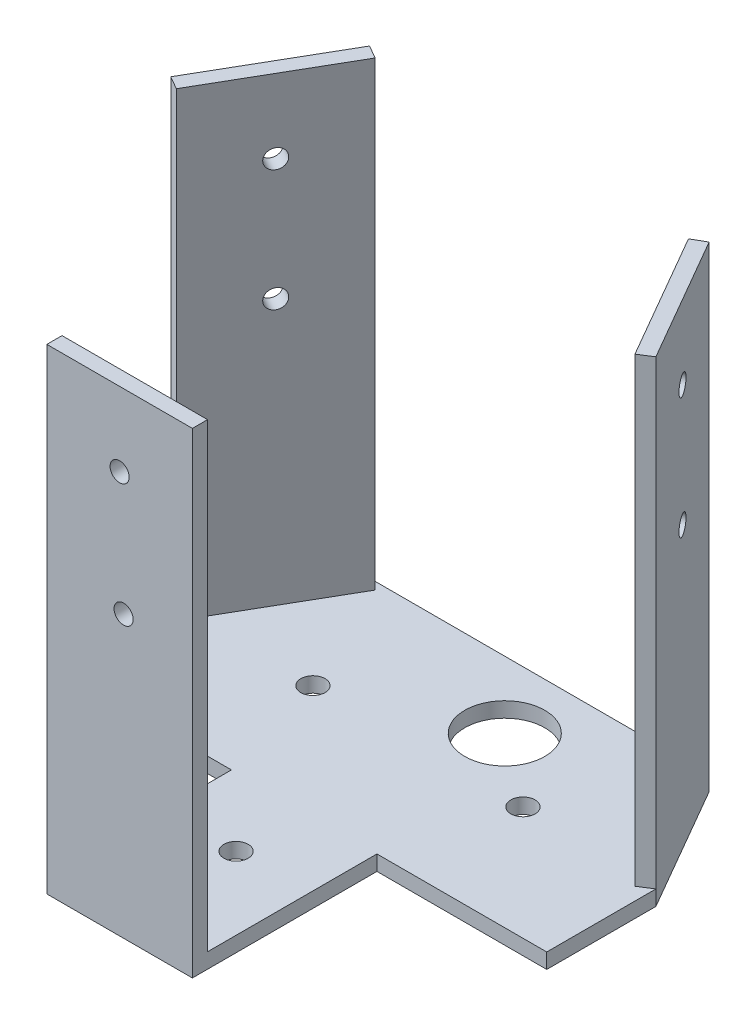
ISO-10303-21;
HEADER;
FILE_DESCRIPTION(('STEP AP214'),'2;1');
FILE_NAME('part.step','',(''),(''),'','','');
FILE_SCHEMA(('AUTOMOTIVE_DESIGN { 1 0 10303 214 1 1 1 1 }'));
ENDSEC;
DATA;
#1=APPLICATION_CONTEXT('core data for automotive mechanical design processes');
#2=APPLICATION_PROTOCOL_DEFINITION('international standard','automotive_design',2000,#1);
#3=PRODUCT_CONTEXT('',#1,'mechanical');
#4=PRODUCT('Part','Part','',(#3));
#5=PRODUCT_RELATED_PRODUCT_CATEGORY('part','',(#4));
#6=PRODUCT_DEFINITION_FORMATION('','',#4);
#7=PRODUCT_DEFINITION_CONTEXT('part definition',#1,'design');
#8=PRODUCT_DEFINITION('design','',#6,#7);
#9=PRODUCT_DEFINITION_SHAPE('','',#8);
#10=(LENGTH_UNIT() NAMED_UNIT(*) SI_UNIT(.MILLI.,.METRE.));
#11=(NAMED_UNIT(*) PLANE_ANGLE_UNIT() SI_UNIT($,.RADIAN.));
#12=(NAMED_UNIT(*) SI_UNIT($,.STERADIAN.) SOLID_ANGLE_UNIT());
#13=UNCERTAINTY_MEASURE_WITH_UNIT(LENGTH_MEASURE(1.E-05),#10,'distance_accuracy_value','');
#14=(GEOMETRIC_REPRESENTATION_CONTEXT(3) GLOBAL_UNCERTAINTY_ASSIGNED_CONTEXT((#13)) GLOBAL_UNIT_ASSIGNED_CONTEXT((#10,
#11,#12)) REPRESENTATION_CONTEXT('',''));
#15=CARTESIAN_POINT('',(0.,0.,0.));
#16=DIRECTION('',(0.,0.,1.));
#17=DIRECTION('',(1.,0.,0.));
#18=AXIS2_PLACEMENT_3D('',#15,#16,#17);
#19=CARTESIAN_POINT('',(0.,1.5875,0.));
#20=DIRECTION('',(0.,1.,0.));
#21=DIRECTION('',(0.,0.,1.));
#22=AXIS2_PLACEMENT_3D('',#19,#20,#21);
#23=PLANE('',#22);
#24=CARTESIAN_POINT('',(28.7785226280624,1.5875,-17.6279871536748));
#25=DIRECTION('',(0.,1.,0.));
#26=DIRECTION('',(0.,0.,1.));
#27=AXIS2_PLACEMENT_3D('',#24,#25,#26);
#28=CIRCLE('',#27,4.19100000000001);
#29=CARTESIAN_POINT('',(28.7785226280624,1.5875,-13.4369871536748));
#30=VERTEX_POINT('',#29);
#31=EDGE_CURVE('E322',#30,#30,#28,.T.);
#32=ORIENTED_EDGE('',*,*,#31,.F.);
#33=EDGE_LOOP('',(#32));
#34=FACE_BOUND('',#33,.T.);
#35=CARTESIAN_POINT('',(14.4014773719377,1.5875,-11.9141212650334));
#36=DIRECTION('',(0.,1.,0.));
#37=DIRECTION('',(0.,0.,1.));
#38=AXIS2_PLACEMENT_3D('',#35,#36,#37);
#39=CIRCLE('',#38,1.27000000000001);
#40=CARTESIAN_POINT('',(14.4014773719377,1.5875,-10.6441212650334));
#41=VERTEX_POINT('',#40);
#42=EDGE_CURVE('E242',#41,#41,#39,.T.);
#43=ORIENTED_EDGE('',*,*,#42,.F.);
#44=EDGE_LOOP('',(#43));
#45=FACE_BOUND('',#44,.T.);
#46=CARTESIAN_POINT('',(36.3985226280624,1.5875,-11.9141212650334));
#47=DIRECTION('',(0.,1.,0.));
#48=DIRECTION('',(0.,0.,1.));
#49=AXIS2_PLACEMENT_3D('',#46,#47,#48);
#50=CIRCLE('',#49,1.27);
#51=CARTESIAN_POINT('',(36.3985226280624,1.5875,-10.6441212650334));
#52=VERTEX_POINT('',#51);
#53=EDGE_CURVE('E261',#52,#52,#50,.T.);
#54=ORIENTED_EDGE('',*,*,#53,.F.);
#55=EDGE_LOOP('',(#54));
#56=FACE_BOUND('',#55,.T.);
#57=CARTESIAN_POINT('',(25.4,1.5875,7.13587873496665));
#58=DIRECTION('',(0.,1.,0.));
#59=DIRECTION('',(0.,0.,1.));
#60=AXIS2_PLACEMENT_3D('',#57,#58,#59);
#61=CIRCLE('',#60,1.27);
#62=CARTESIAN_POINT('',(25.4,1.5875,8.40587873496665));
#63=VERTEX_POINT('',#62);
#64=EDGE_CURVE('E264',#63,#63,#61,.T.);
#65=ORIENTED_EDGE('',*,*,#64,.F.);
#66=EDGE_LOOP('',(#65));
#67=FACE_BOUND('',#66,.T.);
#68=DIRECTION('',(0.,0.,-1.));
#69=VECTOR('',#68,1.);
#70=CARTESIAN_POINT('',(50.8,1.5875,0.));
#71=LINE('',#70,#69);
#72=CARTESIAN_POINT('',(50.8,1.5875,0.));
#73=VERTEX_POINT('',#72);
#74=CARTESIAN_POINT('',(50.8,1.5875,-11.43));
#75=VERTEX_POINT('',#74);
#76=EDGE_CURVE('E245',#73,#75,#71,.T.);
#77=ORIENTED_EDGE('',*,*,#76,.T.);
#78=DIRECTION('',(0.84407034624318,0.,-0.536232459473425));
#79=VECTOR('',#78,1.);
#80=CARTESIAN_POINT('',(49.4600383253389,1.5875,-10.5787309705859));
#81=LINE('',#80,#79);
#82=CARTESIAN_POINT('',(49.4600383253389,1.5875,-10.5787309705859));
#83=VERTEX_POINT('',#82);
#84=EDGE_CURVE('E63',#83,#75,#81,.T.);
#85=ORIENTED_EDGE('',*,*,#84,.F.);
#86=DIRECTION('',(0.5,0.,0.866025403784439));
#87=VECTOR('',#86,1.);
#88=CARTESIAN_POINT('',(41.8064184415405,1.5875,-23.8351894711443));
#89=LINE('',#88,#87);
#90=CARTESIAN_POINT('',(41.8064184415405,1.5875,-23.8351894711443));
#91=VERTEX_POINT('',#90);
#92=EDGE_CURVE('E58',#91,#83,#89,.T.);
#93=ORIENTED_EDGE('',*,*,#92,.F.);
#94=DIRECTION('',(-0.866025403784439,0.,0.499999999999999));
#95=VECTOR('',#94,1.);
#96=CARTESIAN_POINT('',(43.18,1.5875,-24.6282271536748));
#97=LINE('',#96,#95);
#98=CARTESIAN_POINT('',(43.18,1.5875,-24.6282271536748));
#99=VERTEX_POINT('',#98);
#100=EDGE_CURVE('E365',#99,#91,#97,.T.);
#101=ORIENTED_EDGE('',*,*,#100,.F.);
#102=DIRECTION('',(1.,0.,0.));
#103=VECTOR('',#102,1.);
#104=CARTESIAN_POINT('',(0.,1.5875,-24.6282271536748));
#105=LINE('',#104,#103);
#106=CARTESIAN_POINT('',(7.62000000000002,1.5875,-24.6282271536748));
#107=VERTEX_POINT('',#106);
#108=EDGE_CURVE('E248',#107,#99,#105,.T.);
#109=ORIENTED_EDGE('',*,*,#108,.F.);
#110=DIRECTION('',(-0.866025403784438,0.,-0.5));
#111=VECTOR('',#110,1.);
#112=CARTESIAN_POINT('',(7.62000000000002,1.5875,-24.6282271536748));
#113=LINE('',#112,#111);
#114=CARTESIAN_POINT('',(8.99481532850781,1.5875,-23.8344771536748));
#115=VERTEX_POINT('',#114);
#116=EDGE_CURVE('E203',#115,#107,#113,.T.);
#117=ORIENTED_EDGE('',*,*,#116,.F.);
#118=DIRECTION('',(0.500000000000001,0.,-0.866025403784438));
#119=VECTOR('',#118,1.);
#120=CARTESIAN_POINT('',(8.99481532850781,1.5875,-23.8344771536748));
#121=LINE('',#120,#119);
#122=CARTESIAN_POINT('',(1.3748153285078,1.5875,-10.63625));
#123=VERTEX_POINT('',#122);
#124=EDGE_CURVE('E193',#123,#115,#121,.T.);
#125=ORIENTED_EDGE('',*,*,#124,.F.);
#126=DIRECTION('',(0.866025403784438,0.,0.500000000000001));
#127=VECTOR('',#126,1.);
#128=CARTESIAN_POINT('',(1.3748153285078,1.5875,-10.63625));
#129=LINE('',#128,#127);
#130=CARTESIAN_POINT('',(0.,1.5875,-11.43));
#131=VERTEX_POINT('',#130);
#132=EDGE_CURVE('E190',#131,#123,#129,.T.);
#133=ORIENTED_EDGE('',*,*,#132,.F.);
#134=DIRECTION('',(0.,0.,-1.));
#135=VECTOR('',#134,1.);
#136=CARTESIAN_POINT('',(0.,1.5875,0.));
#137=LINE('',#136,#135);
#138=CARTESIAN_POINT('',(0.,1.5875,0.));
#139=VERTEX_POINT('',#138);
#140=EDGE_CURVE('E250',#139,#131,#137,.T.);
#141=ORIENTED_EDGE('',*,*,#140,.F.);
#142=DIRECTION('',(1.,0.,0.));
#143=VECTOR('',#142,1.);
#144=CARTESIAN_POINT('',(0.,1.5875,0.));
#145=LINE('',#144,#143);
#146=CARTESIAN_POINT('',(17.78,1.5875,0.));
#147=VERTEX_POINT('',#146);
#148=EDGE_CURVE('E253',#139,#147,#145,.T.);
#149=ORIENTED_EDGE('',*,*,#148,.T.);
#150=DIRECTION('',(0.,0.,1.));
#151=VECTOR('',#150,1.);
#152=CARTESIAN_POINT('',(17.78,1.5875,0.));
#153=LINE('',#152,#151);
#154=CARTESIAN_POINT('',(17.78,1.5875,17.7403787349666));
#155=VERTEX_POINT('',#154);
#156=EDGE_CURVE('E255',#147,#155,#153,.T.);
#157=ORIENTED_EDGE('',*,*,#156,.T.);
#158=DIRECTION('',(-1.,0.,0.));
#159=VECTOR('',#158,1.);
#160=CARTESIAN_POINT('',(33.02,1.5875,17.7403787349666));
#161=LINE('',#160,#159);
#162=CARTESIAN_POINT('',(33.02,1.5875,17.7403787349666));
#163=VERTEX_POINT('',#162);
#164=EDGE_CURVE('E221',#163,#155,#161,.T.);
#165=ORIENTED_EDGE('',*,*,#164,.F.);
#166=DIRECTION('',(0.,0.,1.));
#167=VECTOR('',#166,1.);
#168=CARTESIAN_POINT('',(33.02,1.5875,0.));
#169=LINE('',#168,#167);
#170=CARTESIAN_POINT('',(33.02,1.5875,0.));
#171=VERTEX_POINT('',#170);
#172=EDGE_CURVE('E258',#171,#163,#169,.T.);
#173=ORIENTED_EDGE('',*,*,#172,.F.);
#174=EDGE_CURVE('E256',#171,#73,#145,.T.);
#175=ORIENTED_EDGE('',*,*,#174,.T.);
#176=EDGE_LOOP('',(#77,#85,#93,#101,#109,#117,#125,#133,#141,#149,#157,#165,#173,#175));
#177=FACE_BOUND('',#176,.T.);
#178=ADVANCED_FACE('F41',(#34,#45,#56,#67,#177),#23,.T.);
#179=CARTESIAN_POINT('',(50.8,1.5875,0.));
#180=DIRECTION('',(-1.,0.,0.));
#181=DIRECTION('',(0.,0.,1.));
#182=AXIS2_PLACEMENT_3D('',#179,#180,#181);
#183=PLANE('',#182);
#184=DIRECTION('',(0.,0.,-1.));
#185=VECTOR('',#184,1.);
#186=CARTESIAN_POINT('',(50.8,0.,0.));
#187=LINE('',#186,#185);
#188=CARTESIAN_POINT('',(50.8,0.,0.));
#189=VERTEX_POINT('',#188);
#190=CARTESIAN_POINT('',(50.8,0.,-11.43));
#191=VERTEX_POINT('',#190);
#192=EDGE_CURVE('E270',#189,#191,#187,.T.);
#193=ORIENTED_EDGE('',*,*,#192,.T.);
#194=DIRECTION('',(0.,-1.,0.));
#195=VECTOR('',#194,1.);
#196=CARTESIAN_POINT('',(50.8,1.5875,-11.43));
#197=LINE('',#196,#195);
#198=EDGE_CURVE('E11',#75,#191,#197,.T.);
#199=ORIENTED_EDGE('',*,*,#198,.F.);
#200=ORIENTED_EDGE('',*,*,#76,.F.);
#201=DIRECTION('',(0.,-1.,0.));
#202=VECTOR('',#201,1.);
#203=CARTESIAN_POINT('',(50.8,1.5875,0.));
#204=LINE('',#203,#202);
#205=EDGE_CURVE('E267',#73,#189,#204,.T.);
#206=ORIENTED_EDGE('',*,*,#205,.T.);
#207=EDGE_LOOP('',(#193,#199,#200,#206));
#208=FACE_BOUND('',#207,.T.);
#209=ADVANCED_FACE('F418',(#208),#183,.F.);
#210=CARTESIAN_POINT('',(43.049335182628,1.5875,-24.8545452561248));
#211=DIRECTION('',(-0.866025403784438,0.,0.500000000000002));
#212=DIRECTION('',(0.500000000000002,0.,0.866025403784438));
#213=AXIS2_PLACEMENT_3D('',#210,#211,#212);
#214=PLANE('',#213);
#215=CARTESIAN_POINT('',(46.99,29.4025,-18.0291135768374));
#216=DIRECTION('',(0.866025403784438,0.,-0.500000000000002));
#217=DIRECTION('',(-0.500000000000002,0.,-0.866025403784438));
#218=AXIS2_PLACEMENT_3D('',#215,#216,#217);
#219=CIRCLE('',#218,0.999999999999999);
#220=CARTESIAN_POINT('',(46.49,29.4025,-18.8951389806219));
#221=VERTEX_POINT('',#220);
#222=EDGE_CURVE('E330',#221,#221,#219,.T.);
#223=ORIENTED_EDGE('',*,*,#222,.F.);
#224=EDGE_LOOP('',(#223));
#225=FACE_BOUND('',#224,.T.);
#226=CARTESIAN_POINT('',(46.99,42.1025,-18.0291135768374));
#227=DIRECTION('',(0.866025403784438,0.,-0.500000000000002));
#228=DIRECTION('',(-0.500000000000002,0.,-0.866025403784438));
#229=AXIS2_PLACEMENT_3D('',#226,#227,#228);
#230=CIRCLE('',#229,0.999999999999999);
#231=CARTESIAN_POINT('',(46.49,42.1025,-18.8951389806219));
#232=VERTEX_POINT('',#231);
#233=EDGE_CURVE('E326',#232,#232,#230,.T.);
#234=ORIENTED_EDGE('',*,*,#233,.F.);
#235=EDGE_LOOP('',(#234));
#236=FACE_BOUND('',#235,.T.);
#237=DIRECTION('',(-0.500000000000002,0.,-0.866025403784438));
#238=VECTOR('',#237,1.);
#239=CARTESIAN_POINT('',(43.049335182628,0.,-24.8545452561248));
#240=LINE('',#239,#238);
#241=CARTESIAN_POINT('',(43.18,0.,-24.6282271536748));
#242=VERTEX_POINT('',#241);
#243=EDGE_CURVE('E273',#191,#242,#240,.T.);
#244=ORIENTED_EDGE('',*,*,#243,.T.);
#245=DIRECTION('',(0.,-1.,0.));
#246=VECTOR('',#245,1.);
#247=CARTESIAN_POINT('',(43.18,1.5875,-24.6282271536748));
#248=LINE('',#247,#246);
#249=EDGE_CURVE('E50',#99,#242,#248,.T.);
#250=ORIENTED_EDGE('',*,*,#249,.F.);
#251=DIRECTION('',(0.,-1.,0.));
#252=VECTOR('',#251,1.);
#253=CARTESIAN_POINT('',(43.18,49.8475,-24.6282271536748));
#254=LINE('',#253,#252);
#255=CARTESIAN_POINT('',(43.18,49.8475,-24.6282271536748));
#256=VERTEX_POINT('',#255);
#257=EDGE_CURVE('E175',#256,#99,#254,.T.);
#258=ORIENTED_EDGE('',*,*,#257,.F.);
#259=DIRECTION('',(-0.500000000000001,0.,-0.866025403784438));
#260=VECTOR('',#259,1.);
#261=CARTESIAN_POINT('',(50.8,49.8475,-11.43));
#262=LINE('',#261,#260);
#263=CARTESIAN_POINT('',(50.8,49.8475,-11.43));
#264=VERTEX_POINT('',#263);
#265=EDGE_CURVE('E167',#264,#256,#262,.T.);
#266=ORIENTED_EDGE('',*,*,#265,.F.);
#267=DIRECTION('',(0.,-1.,0.));
#268=VECTOR('',#267,1.);
#269=CARTESIAN_POINT('',(50.8,49.8475,-11.43));
#270=LINE('',#269,#268);
#271=EDGE_CURVE('E172',#264,#75,#270,.T.);
#272=ORIENTED_EDGE('',*,*,#271,.T.);
#273=ORIENTED_EDGE('',*,*,#198,.T.);
#274=EDGE_LOOP('',(#244,#250,#258,#266,#272,#273));
#275=FACE_BOUND('',#274,.T.);
#276=ADVANCED_FACE('F170',(#225,#236,#275),#214,.F.);
#277=CARTESIAN_POINT('',(0.,1.5875,-24.6282271536748));
#278=DIRECTION('',(0.,0.,-1.));
#279=DIRECTION('',(-1.,0.,0.));
#280=AXIS2_PLACEMENT_3D('',#277,#278,#279);
#281=PLANE('',#280);
#282=DIRECTION('',(1.,0.,0.));
#283=VECTOR('',#282,1.);
#284=CARTESIAN_POINT('',(0.,0.,-24.6282271536748));
#285=LINE('',#284,#283);
#286=CARTESIAN_POINT('',(7.62000000000002,0.,-24.6282271536748));
#287=VERTEX_POINT('',#286);
#288=EDGE_CURVE('E275',#287,#242,#285,.T.);
#289=ORIENTED_EDGE('',*,*,#288,.F.);
#290=DIRECTION('',(0.,-1.,0.));
#291=VECTOR('',#290,1.);
#292=CARTESIAN_POINT('',(7.62000000000002,1.5875,-24.6282271536748));
#293=LINE('',#292,#291);
#294=EDGE_CURVE('E316',#107,#287,#293,.T.);
#295=ORIENTED_EDGE('',*,*,#294,.F.);
#296=ORIENTED_EDGE('',*,*,#108,.T.);
#297=ORIENTED_EDGE('',*,*,#249,.T.);
#298=EDGE_LOOP('',(#289,#295,#296,#297));
#299=FACE_BOUND('',#298,.T.);
#300=ADVANCED_FACE('F380',(#299),#281,.T.);
#301=CARTESIAN_POINT('',(-4.94933518262807,1.5875,-2.85750000000001));
#302=DIRECTION('',(-0.866025403784438,0.,-0.500000000000001));
#303=DIRECTION('',(-0.500000000000001,0.,0.866025403784438));
#304=AXIS2_PLACEMENT_3D('',#301,#302,#303);
#305=PLANE('',#304);
#306=CARTESIAN_POINT('',(3.81,29.4025,-18.0291135768374));
#307=DIRECTION('',(-0.866025403784438,0.,-0.500000000000001));
#308=DIRECTION('',(-0.500000000000001,0.,0.866025403784438));
#309=AXIS2_PLACEMENT_3D('',#306,#307,#308);
#310=CIRCLE('',#309,1.);
#311=CARTESIAN_POINT('',(3.31,29.4025,-17.163088173053));
#312=VERTEX_POINT('',#311);
#313=EDGE_CURVE('E337',#312,#312,#310,.T.);
#314=ORIENTED_EDGE('',*,*,#313,.F.);
#315=EDGE_LOOP('',(#314));
#316=FACE_BOUND('',#315,.T.);
#317=CARTESIAN_POINT('',(3.81,42.1025,-18.0291135768374));
#318=DIRECTION('',(-0.866025403784438,0.,-0.500000000000001));
#319=DIRECTION('',(-0.500000000000001,0.,0.866025403784438));
#320=AXIS2_PLACEMENT_3D('',#317,#318,#319);
#321=CIRCLE('',#320,1.);
#322=CARTESIAN_POINT('',(3.31,42.1025,-17.163088173053));
#323=VERTEX_POINT('',#322);
#324=EDGE_CURVE('E334',#323,#323,#321,.T.);
#325=ORIENTED_EDGE('',*,*,#324,.F.);
#326=EDGE_LOOP('',(#325));
#327=FACE_BOUND('',#326,.T.);
#328=DIRECTION('',(0.500000000000001,0.,-0.866025403784438));
#329=VECTOR('',#328,1.);
#330=CARTESIAN_POINT('',(-4.94933518262807,0.,-2.85750000000001));
#331=LINE('',#330,#329);
#332=CARTESIAN_POINT('',(0.,0.,-11.43));
#333=VERTEX_POINT('',#332);
#334=EDGE_CURVE('E278',#333,#287,#331,.T.);
#335=ORIENTED_EDGE('',*,*,#334,.F.);
#336=DIRECTION('',(0.,-1.,0.));
#337=VECTOR('',#336,1.);
#338=CARTESIAN_POINT('',(0.,1.5875,-11.43));
#339=LINE('',#338,#337);
#340=EDGE_CURVE('E314',#131,#333,#339,.T.);
#341=ORIENTED_EDGE('',*,*,#340,.F.);
#342=DIRECTION('',(0.,-1.,0.));
#343=VECTOR('',#342,1.);
#344=CARTESIAN_POINT('',(0.,49.8475,-11.43));
#345=LINE('',#344,#343);
#346=CARTESIAN_POINT('',(0.,49.8475,-11.43));
#347=VERTEX_POINT('',#346);
#348=EDGE_CURVE('E208',#347,#131,#345,.T.);
#349=ORIENTED_EDGE('',*,*,#348,.F.);
#350=DIRECTION('',(-0.500000000000001,0.,0.866025403784438));
#351=VECTOR('',#350,1.);
#352=CARTESIAN_POINT('',(0.,49.8475,-11.43));
#353=LINE('',#352,#351);
#354=CARTESIAN_POINT('',(7.62000000000002,49.8475,-24.6282271536748));
#355=VERTEX_POINT('',#354);
#356=EDGE_CURVE('E207',#355,#347,#353,.T.);
#357=ORIENTED_EDGE('',*,*,#356,.F.);
#358=DIRECTION('',(0.,-1.,0.));
#359=VECTOR('',#358,1.);
#360=CARTESIAN_POINT('',(7.62000000000002,49.8475,-24.6282271536748));
#361=LINE('',#360,#359);
#362=EDGE_CURVE('E214',#355,#107,#361,.T.);
#363=ORIENTED_EDGE('',*,*,#362,.T.);
#364=ORIENTED_EDGE('',*,*,#294,.T.);
#365=EDGE_LOOP('',(#335,#341,#349,#357,#363,#364));
#366=FACE_BOUND('',#365,.T.);
#367=ADVANCED_FACE('F391',(#316,#327,#366),#305,.T.);
#368=CARTESIAN_POINT('',(0.,1.5875,0.));
#369=DIRECTION('',(-1.,0.,0.));
#370=DIRECTION('',(0.,0.,1.));
#371=AXIS2_PLACEMENT_3D('',#368,#369,#370);
#372=PLANE('',#371);
#373=DIRECTION('',(0.,0.,-1.));
#374=VECTOR('',#373,1.);
#375=CARTESIAN_POINT('',(0.,0.,0.));
#376=LINE('',#375,#374);
#377=CARTESIAN_POINT('',(0.,0.,0.));
#378=VERTEX_POINT('',#377);
#379=EDGE_CURVE('E281',#378,#333,#376,.T.);
#380=ORIENTED_EDGE('',*,*,#379,.F.);
#381=DIRECTION('',(0.,-1.,0.));
#382=VECTOR('',#381,1.);
#383=CARTESIAN_POINT('',(0.,1.5875,0.));
#384=LINE('',#383,#382);
#385=EDGE_CURVE('E312',#139,#378,#384,.T.);
#386=ORIENTED_EDGE('',*,*,#385,.F.);
#387=ORIENTED_EDGE('',*,*,#140,.T.);
#388=ORIENTED_EDGE('',*,*,#340,.T.);
#389=EDGE_LOOP('',(#380,#386,#387,#388));
#390=FACE_BOUND('',#389,.T.);
#391=ADVANCED_FACE('F459',(#390),#372,.T.);
#392=CARTESIAN_POINT('',(0.,1.5875,0.));
#393=DIRECTION('',(0.,0.,-1.));
#394=DIRECTION('',(-1.,0.,0.));
#395=AXIS2_PLACEMENT_3D('',#392,#393,#394);
#396=PLANE('',#395);
#397=DIRECTION('',(1.,0.,0.));
#398=VECTOR('',#397,1.);
#399=CARTESIAN_POINT('',(0.,0.,0.));
#400=LINE('',#399,#398);
#401=CARTESIAN_POINT('',(17.78,0.,0.));
#402=VERTEX_POINT('',#401);
#403=EDGE_CURVE('E284',#378,#402,#400,.T.);
#404=ORIENTED_EDGE('',*,*,#403,.T.);
#405=DIRECTION('',(0.,-1.,0.));
#406=VECTOR('',#405,1.);
#407=CARTESIAN_POINT('',(17.78,1.5875,0.));
#408=LINE('',#407,#406);
#409=EDGE_CURVE('E309',#147,#402,#408,.T.);
#410=ORIENTED_EDGE('',*,*,#409,.F.);
#411=ORIENTED_EDGE('',*,*,#148,.F.);
#412=ORIENTED_EDGE('',*,*,#385,.T.);
#413=EDGE_LOOP('',(#404,#410,#411,#412));
#414=FACE_BOUND('',#413,.T.);
#415=ADVANCED_FACE('F447',(#414),#396,.F.);
#416=CARTESIAN_POINT('',(17.78,1.5875,0.));
#417=DIRECTION('',(1.,0.,0.));
#418=DIRECTION('',(0.,0.,-1.));
#419=AXIS2_PLACEMENT_3D('',#416,#417,#418);
#420=PLANE('',#419);
#421=DIRECTION('',(0.,0.,1.));
#422=VECTOR('',#421,1.);
#423=CARTESIAN_POINT('',(17.78,0.,0.));
#424=LINE('',#423,#422);
#425=CARTESIAN_POINT('',(17.78,0.,19.3278787349666));
#426=VERTEX_POINT('',#425);
#427=EDGE_CURVE('E286',#402,#426,#424,.T.);
#428=ORIENTED_EDGE('',*,*,#427,.T.);
#429=DIRECTION('',(0.,-1.,0.));
#430=VECTOR('',#429,1.);
#431=CARTESIAN_POINT('',(17.78,1.5875,19.3278787349666));
#432=LINE('',#431,#430);
#433=CARTESIAN_POINT('',(17.78,49.8475,19.3278787349666));
#434=VERTEX_POINT('',#433);
#435=EDGE_CURVE('E306',#434,#426,#432,.T.);
#436=ORIENTED_EDGE('',*,*,#435,.F.);
#437=DIRECTION('',(0.,0.,1.));
#438=VECTOR('',#437,1.);
#439=CARTESIAN_POINT('',(17.78,49.8475,19.3278787349666));
#440=LINE('',#439,#438);
#441=CARTESIAN_POINT('',(17.78,49.8475,17.7403787349666));
#442=VERTEX_POINT('',#441);
#443=EDGE_CURVE('E227',#442,#434,#440,.T.);
#444=ORIENTED_EDGE('',*,*,#443,.F.);
#445=DIRECTION('',(0.,-1.,0.));
#446=VECTOR('',#445,1.);
#447=CARTESIAN_POINT('',(17.78,49.8475,17.7403787349666));
#448=LINE('',#447,#446);
#449=EDGE_CURVE('E233',#442,#155,#448,.T.);
#450=ORIENTED_EDGE('',*,*,#449,.T.);
#451=ORIENTED_EDGE('',*,*,#156,.F.);
#452=ORIENTED_EDGE('',*,*,#409,.T.);
#453=EDGE_LOOP('',(#428,#436,#444,#450,#451,#452));
#454=FACE_BOUND('',#453,.T.);
#455=ADVANCED_FACE('F454',(#454),#420,.F.);
#456=CARTESIAN_POINT('',(0.,1.5875,19.3278787349666));
#457=DIRECTION('',(0.,0.,-1.));
#458=DIRECTION('',(-1.,0.,0.));
#459=AXIS2_PLACEMENT_3D('',#456,#457,#458);
#460=PLANE('',#459);
#461=CARTESIAN_POINT('',(25.8182234490067,29.4025,19.3278787349666));
#462=DIRECTION('',(0.,0.,1.));
#463=DIRECTION('',(1.,0.,0.));
#464=AXIS2_PLACEMENT_3D('',#461,#462,#463);
#465=CIRCLE('',#464,1.);
#466=CARTESIAN_POINT('',(26.8182234490067,29.4025,19.3278787349666));
#467=VERTEX_POINT('',#466);
#468=EDGE_CURVE('E350',#467,#467,#465,.T.);
#469=ORIENTED_EDGE('',*,*,#468,.F.);
#470=EDGE_LOOP('',(#469));
#471=FACE_BOUND('',#470,.T.);
#472=CARTESIAN_POINT('',(25.4,42.1025,19.3278787349666));
#473=DIRECTION('',(0.,0.,1.));
#474=DIRECTION('',(1.,0.,0.));
#475=AXIS2_PLACEMENT_3D('',#472,#473,#474);
#476=CIRCLE('',#475,1.);
#477=CARTESIAN_POINT('',(26.4,42.1025,19.3278787349666));
#478=VERTEX_POINT('',#477);
#479=EDGE_CURVE('E340',#478,#478,#476,.T.);
#480=ORIENTED_EDGE('',*,*,#479,.F.);
#481=EDGE_LOOP('',(#480));
#482=FACE_BOUND('',#481,.T.);
#483=DIRECTION('',(1.,0.,0.));
#484=VECTOR('',#483,1.);
#485=CARTESIAN_POINT('',(0.,0.,19.3278787349666));
#486=LINE('',#485,#484);
#487=CARTESIAN_POINT('',(33.02,0.,19.3278787349666));
#488=VERTEX_POINT('',#487);
#489=EDGE_CURVE('E289',#426,#488,#486,.T.);
#490=ORIENTED_EDGE('',*,*,#489,.T.);
#491=DIRECTION('',(0.,-1.,0.));
#492=VECTOR('',#491,1.);
#493=CARTESIAN_POINT('',(33.02,1.5875,19.3278787349666));
#494=LINE('',#493,#492);
#495=CARTESIAN_POINT('',(33.02,49.8475,19.3278787349666));
#496=VERTEX_POINT('',#495);
#497=EDGE_CURVE('E304',#496,#488,#494,.T.);
#498=ORIENTED_EDGE('',*,*,#497,.F.);
#499=DIRECTION('',(1.,0.,0.));
#500=VECTOR('',#499,1.);
#501=CARTESIAN_POINT('',(33.02,49.8475,19.3278787349666));
#502=LINE('',#501,#500);
#503=EDGE_CURVE('E230',#434,#496,#502,.T.);
#504=ORIENTED_EDGE('',*,*,#503,.F.);
#505=ORIENTED_EDGE('',*,*,#435,.T.);
#506=EDGE_LOOP('',(#490,#498,#504,#505));
#507=FACE_BOUND('',#506,.T.);
#508=ADVANCED_FACE('F450',(#471,#482,#507),#460,.F.);
#509=CARTESIAN_POINT('',(33.02,1.5875,0.));
#510=DIRECTION('',(1.,0.,0.));
#511=DIRECTION('',(0.,0.,-1.));
#512=AXIS2_PLACEMENT_3D('',#509,#510,#511);
#513=PLANE('',#512);
#514=DIRECTION('',(0.,0.,1.));
#515=VECTOR('',#514,1.);
#516=CARTESIAN_POINT('',(33.02,0.,0.));
#517=LINE('',#516,#515);
#518=CARTESIAN_POINT('',(33.02,0.,0.));
#519=VERTEX_POINT('',#518);
#520=EDGE_CURVE('E292',#519,#488,#517,.T.);
#521=ORIENTED_EDGE('',*,*,#520,.F.);
#522=DIRECTION('',(0.,-1.,0.));
#523=VECTOR('',#522,1.);
#524=CARTESIAN_POINT('',(33.02,1.5875,0.));
#525=LINE('',#524,#523);
#526=EDGE_CURVE('E302',#171,#519,#525,.T.);
#527=ORIENTED_EDGE('',*,*,#526,.F.);
#528=ORIENTED_EDGE('',*,*,#172,.T.);
#529=DIRECTION('',(0.,-1.,0.));
#530=VECTOR('',#529,1.);
#531=CARTESIAN_POINT('',(33.02,49.8475,17.7403787349666));
#532=LINE('',#531,#530);
#533=CARTESIAN_POINT('',(33.02,49.8475,17.7403787349666));
#534=VERTEX_POINT('',#533);
#535=EDGE_CURVE('E238',#534,#163,#532,.T.);
#536=ORIENTED_EDGE('',*,*,#535,.F.);
#537=DIRECTION('',(0.,0.,-1.));
#538=VECTOR('',#537,1.);
#539=CARTESIAN_POINT('',(33.02,49.8475,19.3278787349666));
#540=LINE('',#539,#538);
#541=EDGE_CURVE('E222',#496,#534,#540,.T.);
#542=ORIENTED_EDGE('',*,*,#541,.F.);
#543=ORIENTED_EDGE('',*,*,#497,.T.);
#544=EDGE_LOOP('',(#521,#527,#528,#536,#542,#543));
#545=FACE_BOUND('',#544,.T.);
#546=ADVANCED_FACE('F442',(#545),#513,.T.);
#547=CARTESIAN_POINT('',(36.3985226280624,1.5875,-11.9141212650334));
#548=DIRECTION('',(0.,-1.,0.));
#549=DIRECTION('',(0.,0.,-1.));
#550=AXIS2_PLACEMENT_3D('',#547,#548,#549);
#551=CYLINDRICAL_SURFACE('',#550,1.27);
#552=ORIENTED_EDGE('',*,*,#53,.T.);
#553=EDGE_LOOP('',(#552));
#554=FACE_BOUND('',#553,.T.);
#555=CARTESIAN_POINT('',(36.3985226280624,0.,-11.9141212650334));
#556=DIRECTION('',(0.,1.,0.));
#557=DIRECTION('',(0.,0.,1.));
#558=AXIS2_PLACEMENT_3D('',#555,#556,#557);
#559=CIRCLE('',#558,1.27);
#560=CARTESIAN_POINT('',(36.3985226280624,0.,-10.6441212650334));
#561=VERTEX_POINT('',#560);
#562=EDGE_CURVE('E295',#561,#561,#559,.T.);
#563=ORIENTED_EDGE('',*,*,#562,.F.);
#564=EDGE_LOOP('',(#563));
#565=FACE_BOUND('',#564,.T.);
#566=ADVANCED_FACE('F438',(#554,#565),#551,.F.);
#567=EDGE_CURVE('E287',#519,#189,#400,.T.);
#568=ORIENTED_EDGE('',*,*,#567,.T.);
#569=ORIENTED_EDGE('',*,*,#205,.F.);
#570=ORIENTED_EDGE('',*,*,#174,.F.);
#571=ORIENTED_EDGE('',*,*,#526,.T.);
#572=EDGE_LOOP('',(#568,#569,#570,#571));
#573=FACE_BOUND('',#572,.T.);
#574=ADVANCED_FACE('F441',(#573),#396,.F.);
#575=CARTESIAN_POINT('',(14.4014773719377,1.5875,-11.9141212650334));
#576=DIRECTION('',(0.,-1.,0.));
#577=DIRECTION('',(0.,0.,-1.));
#578=AXIS2_PLACEMENT_3D('',#575,#576,#577);
#579=CYLINDRICAL_SURFACE('',#578,1.27000000000001);
#580=ORIENTED_EDGE('',*,*,#42,.T.);
#581=EDGE_LOOP('',(#580));
#582=FACE_BOUND('',#581,.T.);
#583=CARTESIAN_POINT('',(14.4014773719377,0.,-11.9141212650334));
#584=DIRECTION('',(0.,1.,0.));
#585=DIRECTION('',(0.,0.,1.));
#586=AXIS2_PLACEMENT_3D('',#583,#584,#585);
#587=CIRCLE('',#586,1.27000000000001);
#588=CARTESIAN_POINT('',(14.4014773719377,0.,-10.6441212650334));
#589=VERTEX_POINT('',#588);
#590=EDGE_CURVE('E241',#589,#589,#587,.T.);
#591=ORIENTED_EDGE('',*,*,#590,.F.);
#592=EDGE_LOOP('',(#591));
#593=FACE_BOUND('',#592,.T.);
#594=ADVANCED_FACE('F43',(#582,#593),#579,.F.);
#595=CARTESIAN_POINT('',(25.4,1.5875,7.13587873496665));
#596=DIRECTION('',(0.,-1.,0.));
#597=DIRECTION('',(0.,0.,-1.));
#598=AXIS2_PLACEMENT_3D('',#595,#596,#597);
#599=CYLINDRICAL_SURFACE('',#598,1.27);
#600=ORIENTED_EDGE('',*,*,#64,.T.);
#601=EDGE_LOOP('',(#600));
#602=FACE_BOUND('',#601,.T.);
#603=CARTESIAN_POINT('',(25.4,0.,7.13587873496665));
#604=DIRECTION('',(0.,1.,0.));
#605=DIRECTION('',(0.,0.,1.));
#606=AXIS2_PLACEMENT_3D('',#603,#604,#605);
#607=CIRCLE('',#606,1.27);
#608=CARTESIAN_POINT('',(25.4,0.,8.40587873496665));
#609=VERTEX_POINT('',#608);
#610=EDGE_CURVE('E246',#609,#609,#607,.T.);
#611=ORIENTED_EDGE('',*,*,#610,.F.);
#612=EDGE_LOOP('',(#611));
#613=FACE_BOUND('',#612,.T.);
#614=ADVANCED_FACE('F433',(#602,#613),#599,.F.);
#615=CARTESIAN_POINT('',(0.,0.,0.));
#616=DIRECTION('',(0.,1.,0.));
#617=DIRECTION('',(0.,0.,1.));
#618=AXIS2_PLACEMENT_3D('',#615,#616,#617);
#619=PLANE('',#618);
#620=CARTESIAN_POINT('',(28.7785226280624,0.,-17.6279871536748));
#621=DIRECTION('',(0.,1.,0.));
#622=DIRECTION('',(0.,0.,1.));
#623=AXIS2_PLACEMENT_3D('',#620,#621,#622);
#624=CIRCLE('',#623,4.19100000000001);
#625=CARTESIAN_POINT('',(28.7785226280624,0.,-13.4369871536748));
#626=VERTEX_POINT('',#625);
#627=EDGE_CURVE('E319',#626,#626,#624,.T.);
#628=ORIENTED_EDGE('',*,*,#627,.T.);
#629=EDGE_LOOP('',(#628));
#630=FACE_BOUND('',#629,.T.);
#631=ORIENTED_EDGE('',*,*,#590,.T.);
#632=EDGE_LOOP('',(#631));
#633=FACE_BOUND('',#632,.T.);
#634=ORIENTED_EDGE('',*,*,#192,.F.);
#635=ORIENTED_EDGE('',*,*,#567,.F.);
#636=ORIENTED_EDGE('',*,*,#520,.T.);
#637=ORIENTED_EDGE('',*,*,#489,.F.);
#638=ORIENTED_EDGE('',*,*,#427,.F.);
#639=ORIENTED_EDGE('',*,*,#403,.F.);
#640=ORIENTED_EDGE('',*,*,#379,.T.);
#641=ORIENTED_EDGE('',*,*,#334,.T.);
#642=ORIENTED_EDGE('',*,*,#288,.T.);
#643=ORIENTED_EDGE('',*,*,#243,.F.);
#644=EDGE_LOOP('',(#634,#635,#636,#637,#638,#639,#640,#641,#642,#643));
#645=FACE_BOUND('',#644,.T.);
#646=ORIENTED_EDGE('',*,*,#562,.T.);
#647=EDGE_LOOP('',(#646));
#648=FACE_BOUND('',#647,.T.);
#649=ORIENTED_EDGE('',*,*,#610,.T.);
#650=EDGE_LOOP('',(#649));
#651=FACE_BOUND('',#650,.T.);
#652=ADVANCED_FACE('F384',(#630,#633,#645,#648,#651),#619,.F.);
#653=CARTESIAN_POINT('',(33.02,49.8475,17.7403787349666));
#654=DIRECTION('',(0.,0.,1.));
#655=DIRECTION('',(1.,0.,0.));
#656=AXIS2_PLACEMENT_3D('',#653,#654,#655);
#657=PLANE('',#656);
#658=CARTESIAN_POINT('',(25.8182234490067,29.4025,17.7403787349666));
#659=DIRECTION('',(0.,0.,1.));
#660=DIRECTION('',(1.,0.,0.));
#661=AXIS2_PLACEMENT_3D('',#658,#659,#660);
#662=CIRCLE('',#661,1.);
#663=CARTESIAN_POINT('',(26.8182234490067,29.4025,17.7403787349666));
#664=VERTEX_POINT('',#663);
#665=EDGE_CURVE('E45',#664,#664,#662,.T.);
#666=ORIENTED_EDGE('',*,*,#665,.T.);
#667=EDGE_LOOP('',(#666));
#668=FACE_BOUND('',#667,.T.);
#669=CARTESIAN_POINT('',(25.4,42.1025,17.7403787349666));
#670=DIRECTION('',(0.,0.,1.));
#671=DIRECTION('',(1.,0.,0.));
#672=AXIS2_PLACEMENT_3D('',#669,#670,#671);
#673=CIRCLE('',#672,1.);
#674=CARTESIAN_POINT('',(26.4,42.1025,17.7403787349666));
#675=VERTEX_POINT('',#674);
#676=EDGE_CURVE('E338',#675,#675,#673,.T.);
#677=ORIENTED_EDGE('',*,*,#676,.T.);
#678=EDGE_LOOP('',(#677));
#679=FACE_BOUND('',#678,.T.);
#680=ORIENTED_EDGE('',*,*,#164,.T.);
#681=ORIENTED_EDGE('',*,*,#449,.F.);
#682=DIRECTION('',(-1.,0.,0.));
#683=VECTOR('',#682,1.);
#684=CARTESIAN_POINT('',(33.02,49.8475,17.7403787349666));
#685=LINE('',#684,#683);
#686=EDGE_CURVE('E225',#534,#442,#685,.T.);
#687=ORIENTED_EDGE('',*,*,#686,.F.);
#688=ORIENTED_EDGE('',*,*,#535,.T.);
#689=EDGE_LOOP('',(#680,#681,#687,#688));
#690=FACE_BOUND('',#689,.T.);
#691=ADVANCED_FACE('F429',(#668,#679,#690),#657,.F.);
#692=CARTESIAN_POINT('',(0.,49.8475,0.));
#693=DIRECTION('',(0.,1.,0.));
#694=DIRECTION('',(0.,0.,1.));
#695=AXIS2_PLACEMENT_3D('',#692,#693,#694);
#696=PLANE('',#695);
#697=ORIENTED_EDGE('',*,*,#541,.T.);
#698=ORIENTED_EDGE('',*,*,#686,.T.);
#699=ORIENTED_EDGE('',*,*,#443,.T.);
#700=ORIENTED_EDGE('',*,*,#503,.T.);
#701=EDGE_LOOP('',(#697,#698,#699,#700));
#702=FACE_BOUND('',#701,.T.);
#703=ADVANCED_FACE('F522',(#702),#696,.T.);
#704=CARTESIAN_POINT('',(1.3748153285078,49.8475,-10.63625));
#705=DIRECTION('',(0.500000000000001,0.,-0.866025403784438));
#706=DIRECTION('',(-0.866025403784438,0.,-0.500000000000001));
#707=AXIS2_PLACEMENT_3D('',#704,#705,#706);
#708=PLANE('',#707);
#709=ORIENTED_EDGE('',*,*,#132,.T.);
#710=DIRECTION('',(0.,-1.,0.));
#711=VECTOR('',#710,1.);
#712=CARTESIAN_POINT('',(1.3748153285078,49.8475,-10.63625));
#713=LINE('',#712,#711);
#714=CARTESIAN_POINT('',(1.3748153285078,49.8475,-10.63625));
#715=VERTEX_POINT('',#714);
#716=EDGE_CURVE('E219',#715,#123,#713,.T.);
#717=ORIENTED_EDGE('',*,*,#716,.F.);
#718=DIRECTION('',(0.866025403784438,0.,0.500000000000001));
#719=VECTOR('',#718,1.);
#720=CARTESIAN_POINT('',(1.3748153285078,49.8475,-10.63625));
#721=LINE('',#720,#719);
#722=EDGE_CURVE('E199',#347,#715,#721,.T.);
#723=ORIENTED_EDGE('',*,*,#722,.F.);
#724=ORIENTED_EDGE('',*,*,#348,.T.);
#725=EDGE_LOOP('',(#709,#717,#723,#724));
#726=FACE_BOUND('',#725,.T.);
#727=ADVANCED_FACE('F405',(#726),#708,.F.);
#728=CARTESIAN_POINT('',(8.99481532850781,49.8475,-23.8344771536748));
#729=DIRECTION('',(-0.866025403784438,0.,-0.500000000000001));
#730=DIRECTION('',(-0.500000000000001,0.,0.866025403784438));
#731=AXIS2_PLACEMENT_3D('',#728,#729,#730);
#732=PLANE('',#731);
#733=CARTESIAN_POINT('',(5.1848153285078,29.4025,-17.2353635768374));
#734=DIRECTION('',(-0.866025403784438,0.,-0.500000000000001));
#735=DIRECTION('',(-0.500000000000001,0.,0.866025403784438));
#736=AXIS2_PLACEMENT_3D('',#733,#734,#735);
#737=CIRCLE('',#736,1.);
#738=CARTESIAN_POINT('',(4.6848153285078,29.4025,-16.369338173053));
#739=VERTEX_POINT('',#738);
#740=EDGE_CURVE('E335',#739,#739,#737,.T.);
#741=ORIENTED_EDGE('',*,*,#740,.T.);
#742=EDGE_LOOP('',(#741));
#743=FACE_BOUND('',#742,.T.);
#744=CARTESIAN_POINT('',(5.1848153285078,42.1025,-17.2353635768374));
#745=DIRECTION('',(-0.866025403784438,0.,-0.500000000000001));
#746=DIRECTION('',(-0.500000000000001,0.,0.866025403784438));
#747=AXIS2_PLACEMENT_3D('',#744,#745,#746);
#748=CIRCLE('',#747,1.);
#749=CARTESIAN_POINT('',(4.6848153285078,42.1025,-16.369338173053));
#750=VERTEX_POINT('',#749);
#751=EDGE_CURVE('E331',#750,#750,#748,.T.);
#752=ORIENTED_EDGE('',*,*,#751,.T.);
#753=EDGE_LOOP('',(#752));
#754=FACE_BOUND('',#753,.T.);
#755=ORIENTED_EDGE('',*,*,#124,.T.);
#756=DIRECTION('',(0.,-1.,0.));
#757=VECTOR('',#756,1.);
#758=CARTESIAN_POINT('',(8.99481532850781,49.8475,-23.8344771536748));
#759=LINE('',#758,#757);
#760=CARTESIAN_POINT('',(8.99481532850781,49.8475,-23.8344771536748));
#761=VERTEX_POINT('',#760);
#762=EDGE_CURVE('E216',#761,#115,#759,.T.);
#763=ORIENTED_EDGE('',*,*,#762,.F.);
#764=DIRECTION('',(0.500000000000001,0.,-0.866025403784438));
#765=VECTOR('',#764,1.);
#766=CARTESIAN_POINT('',(8.99481532850781,49.8475,-23.8344771536748));
#767=LINE('',#766,#765);
#768=EDGE_CURVE('E202',#715,#761,#767,.T.);
#769=ORIENTED_EDGE('',*,*,#768,.F.);
#770=ORIENTED_EDGE('',*,*,#716,.T.);
#771=EDGE_LOOP('',(#755,#763,#769,#770));
#772=FACE_BOUND('',#771,.T.);
#773=ADVANCED_FACE('F400',(#743,#754,#772),#732,.F.);
#774=CARTESIAN_POINT('',(7.62000000000002,49.8475,-24.6282271536748));
#775=DIRECTION('',(-0.5,0.,0.866025403784438));
#776=DIRECTION('',(0.866025403784438,0.,0.5));
#777=AXIS2_PLACEMENT_3D('',#774,#775,#776);
#778=PLANE('',#777);
#779=ORIENTED_EDGE('',*,*,#116,.T.);
#780=ORIENTED_EDGE('',*,*,#362,.F.);
#781=DIRECTION('',(-0.866025403784438,0.,-0.5));
#782=VECTOR('',#781,1.);
#783=CARTESIAN_POINT('',(7.62000000000002,49.8475,-24.6282271536748));
#784=LINE('',#783,#782);
#785=EDGE_CURVE('E205',#761,#355,#784,.T.);
#786=ORIENTED_EDGE('',*,*,#785,.F.);
#787=ORIENTED_EDGE('',*,*,#762,.T.);
#788=EDGE_LOOP('',(#779,#780,#786,#787));
#789=FACE_BOUND('',#788,.T.);
#790=ADVANCED_FACE('F397',(#789),#778,.F.);
#791=CARTESIAN_POINT('',(0.,49.8475,0.));
#792=DIRECTION('',(0.,-1.,0.));
#793=DIRECTION('',(0.,0.,-1.));
#794=AXIS2_PLACEMENT_3D('',#791,#792,#793);
#795=PLANE('',#794);
#796=ORIENTED_EDGE('',*,*,#722,.T.);
#797=ORIENTED_EDGE('',*,*,#768,.T.);
#798=ORIENTED_EDGE('',*,*,#785,.T.);
#799=ORIENTED_EDGE('',*,*,#356,.T.);
#800=EDGE_LOOP('',(#796,#797,#798,#799));
#801=FACE_BOUND('',#800,.T.);
#802=ADVANCED_FACE('F408',(#801),#795,.F.);
#803=CARTESIAN_POINT('',(49.4600383253389,49.8475,-10.5787309705859));
#804=DIRECTION('',(-0.536232459473425,0.,-0.84407034624318));
#805=DIRECTION('',(-0.84407034624318,0.,0.536232459473425));
#806=AXIS2_PLACEMENT_3D('',#803,#804,#805);
#807=PLANE('',#806);
#808=ORIENTED_EDGE('',*,*,#84,.T.);
#809=ORIENTED_EDGE('',*,*,#271,.F.);
#810=DIRECTION('',(0.84407034624318,0.,-0.536232459473425));
#811=VECTOR('',#810,1.);
#812=CARTESIAN_POINT('',(49.4600383253389,49.8475,-10.5787309705859));
#813=LINE('',#812,#811);
#814=CARTESIAN_POINT('',(49.4600383253389,49.8475,-10.5787309705859));
#815=VERTEX_POINT('',#814);
#816=EDGE_CURVE('E179',#815,#264,#813,.T.);
#817=ORIENTED_EDGE('',*,*,#816,.F.);
#818=DIRECTION('',(0.,-1.,0.));
#819=VECTOR('',#818,1.);
#820=CARTESIAN_POINT('',(49.4600383253389,49.8475,-10.5787309705859));
#821=LINE('',#820,#819);
#822=EDGE_CURVE('E363',#815,#83,#821,.T.);
#823=ORIENTED_EDGE('',*,*,#822,.T.);
#824=EDGE_LOOP('',(#808,#809,#817,#823));
#825=FACE_BOUND('',#824,.T.);
#826=ADVANCED_FACE('F189',(#825),#807,.F.);
#827=CARTESIAN_POINT('',(43.18,49.8475,-24.6282271536748));
#828=DIRECTION('',(0.499999999999999,0.,0.866025403784439));
#829=DIRECTION('',(0.866025403784439,0.,-0.499999999999999));
#830=AXIS2_PLACEMENT_3D('',#827,#828,#829);
#831=PLANE('',#830);
#832=ORIENTED_EDGE('',*,*,#100,.T.);
#833=DIRECTION('',(0.,-1.,0.));
#834=VECTOR('',#833,1.);
#835=CARTESIAN_POINT('',(41.8064184415405,49.8475,-23.8351894711443));
#836=LINE('',#835,#834);
#837=CARTESIAN_POINT('',(41.8064184415405,49.8475,-23.8351894711443));
#838=VERTEX_POINT('',#837);
#839=EDGE_CURVE('E195',#838,#91,#836,.T.);
#840=ORIENTED_EDGE('',*,*,#839,.F.);
#841=DIRECTION('',(-0.866025403784439,0.,0.499999999999999));
#842=VECTOR('',#841,1.);
#843=CARTESIAN_POINT('',(43.18,49.8475,-24.6282271536748));
#844=LINE('',#843,#842);
#845=EDGE_CURVE('E178',#256,#838,#844,.T.);
#846=ORIENTED_EDGE('',*,*,#845,.F.);
#847=ORIENTED_EDGE('',*,*,#257,.T.);
#848=EDGE_LOOP('',(#832,#840,#846,#847));
#849=FACE_BOUND('',#848,.T.);
#850=ADVANCED_FACE('F373',(#849),#831,.F.);
#851=CARTESIAN_POINT('',(41.8064184415405,49.8475,-23.8351894711443));
#852=DIRECTION('',(0.866025403784439,0.,-0.5));
#853=DIRECTION('',(-0.5,0.,-0.866025403784439));
#854=AXIS2_PLACEMENT_3D('',#851,#852,#853);
#855=PLANE('',#854);
#856=CARTESIAN_POINT('',(45.6164184415405,29.4025,-17.2360758943069));
#857=DIRECTION('',(0.866025403784439,0.,-0.5));
#858=DIRECTION('',(-0.5,0.,-0.866025403784439));
#859=AXIS2_PLACEMENT_3D('',#856,#857,#858);
#860=CIRCLE('',#859,0.999999999999999);
#861=CARTESIAN_POINT('',(45.1164184415405,29.4025,-18.1021012980913));
#862=VERTEX_POINT('',#861);
#863=EDGE_CURVE('E327',#862,#862,#860,.T.);
#864=ORIENTED_EDGE('',*,*,#863,.T.);
#865=EDGE_LOOP('',(#864));
#866=FACE_BOUND('',#865,.T.);
#867=CARTESIAN_POINT('',(45.6164184415405,42.1025,-17.2360758943069));
#868=DIRECTION('',(0.866025403784439,0.,-0.5));
#869=DIRECTION('',(-0.5,0.,-0.866025403784439));
#870=AXIS2_PLACEMENT_3D('',#867,#868,#869);
#871=CIRCLE('',#870,0.999999999999999);
#872=CARTESIAN_POINT('',(45.1164184415405,42.1025,-18.1021012980913));
#873=VERTEX_POINT('',#872);
#874=EDGE_CURVE('E323',#873,#873,#871,.T.);
#875=ORIENTED_EDGE('',*,*,#874,.T.);
#876=EDGE_LOOP('',(#875));
#877=FACE_BOUND('',#876,.T.);
#878=ORIENTED_EDGE('',*,*,#92,.T.);
#879=ORIENTED_EDGE('',*,*,#822,.F.);
#880=DIRECTION('',(0.5,0.,0.866025403784439));
#881=VECTOR('',#880,1.);
#882=CARTESIAN_POINT('',(41.8064184415405,49.8475,-23.8351894711443));
#883=LINE('',#882,#881);
#884=EDGE_CURVE('E184',#838,#815,#883,.T.);
#885=ORIENTED_EDGE('',*,*,#884,.F.);
#886=ORIENTED_EDGE('',*,*,#839,.T.);
#887=EDGE_LOOP('',(#878,#879,#885,#886));
#888=FACE_BOUND('',#887,.T.);
#889=ADVANCED_FACE('F371',(#866,#877,#888),#855,.F.);
#890=CARTESIAN_POINT('',(0.,49.8475,0.));
#891=DIRECTION('',(0.,1.,0.));
#892=DIRECTION('',(0.,0.,1.));
#893=AXIS2_PLACEMENT_3D('',#890,#891,#892);
#894=PLANE('',#893);
#895=ORIENTED_EDGE('',*,*,#816,.T.);
#896=ORIENTED_EDGE('',*,*,#265,.T.);
#897=ORIENTED_EDGE('',*,*,#845,.T.);
#898=ORIENTED_EDGE('',*,*,#884,.T.);
#899=EDGE_LOOP('',(#895,#896,#897,#898));
#900=FACE_BOUND('',#899,.T.);
#901=ADVANCED_FACE('F182',(#900),#894,.T.);
#902=CARTESIAN_POINT('',(28.7785226280624,-0.9525,-17.6279871536748));
#903=DIRECTION('',(0.,1.,0.));
#904=DIRECTION('',(0.,0.,1.));
#905=AXIS2_PLACEMENT_3D('',#902,#903,#904);
#906=CYLINDRICAL_SURFACE('',#905,4.19100000000001);
#907=ORIENTED_EDGE('',*,*,#31,.T.);
#908=EDGE_LOOP('',(#907));
#909=FACE_BOUND('',#908,.T.);
#910=ORIENTED_EDGE('',*,*,#627,.F.);
#911=EDGE_LOOP('',(#910));
#912=FACE_BOUND('',#911,.T.);
#913=ADVANCED_FACE('F480',(#909,#912),#906,.F.);
#914=CARTESIAN_POINT('',(44.7902954743875,42.1025,-16.7591135768374));
#915=DIRECTION('',(0.866025403784438,0.,-0.500000000000002));
#916=DIRECTION('',(-0.500000000000002,0.,-0.866025403784438));
#917=AXIS2_PLACEMENT_3D('',#914,#915,#916);
#918=CYLINDRICAL_SURFACE('',#917,0.999999999999999);
#919=ORIENTED_EDGE('',*,*,#233,.T.);
#920=EDGE_LOOP('',(#919));
#921=FACE_BOUND('',#920,.T.);
#922=ORIENTED_EDGE('',*,*,#874,.F.);
#923=EDGE_LOOP('',(#922));
#924=FACE_BOUND('',#923,.T.);
#925=ADVANCED_FACE('F476',(#921,#924),#918,.F.);
#926=CARTESIAN_POINT('',(44.7902954743875,29.4025,-16.7591135768374));
#927=DIRECTION('',(0.866025403784438,0.,-0.500000000000002));
#928=DIRECTION('',(-0.500000000000002,0.,-0.866025403784438));
#929=AXIS2_PLACEMENT_3D('',#926,#927,#928);
#930=CYLINDRICAL_SURFACE('',#929,0.999999999999999);
#931=ORIENTED_EDGE('',*,*,#222,.T.);
#932=EDGE_LOOP('',(#931));
#933=FACE_BOUND('',#932,.T.);
#934=ORIENTED_EDGE('',*,*,#863,.F.);
#935=EDGE_LOOP('',(#934));
#936=FACE_BOUND('',#935,.T.);
#937=ADVANCED_FACE('F479',(#933,#936),#930,.F.);
#938=CARTESIAN_POINT('',(6.00970452561248,42.1025,-16.7591135768374));
#939=DIRECTION('',(-0.866025403784438,0.,-0.500000000000001));
#940=DIRECTION('',(-0.500000000000001,0.,0.866025403784438));
#941=AXIS2_PLACEMENT_3D('',#938,#939,#940);
#942=CYLINDRICAL_SURFACE('',#941,1.);
#943=ORIENTED_EDGE('',*,*,#324,.T.);
#944=EDGE_LOOP('',(#943));
#945=FACE_BOUND('',#944,.T.);
#946=ORIENTED_EDGE('',*,*,#751,.F.);
#947=EDGE_LOOP('',(#946));
#948=FACE_BOUND('',#947,.T.);
#949=ADVANCED_FACE('F499',(#945,#948),#942,.F.);
#950=CARTESIAN_POINT('',(6.00970452561248,29.4025,-16.7591135768374));
#951=DIRECTION('',(-0.866025403784438,0.,-0.500000000000001));
#952=DIRECTION('',(-0.500000000000001,0.,0.866025403784438));
#953=AXIS2_PLACEMENT_3D('',#950,#951,#952);
#954=CYLINDRICAL_SURFACE('',#953,1.);
#955=ORIENTED_EDGE('',*,*,#313,.T.);
#956=EDGE_LOOP('',(#955));
#957=FACE_BOUND('',#956,.T.);
#958=ORIENTED_EDGE('',*,*,#740,.F.);
#959=EDGE_LOOP('',(#958));
#960=FACE_BOUND('',#959,.T.);
#961=ADVANCED_FACE('F503',(#957,#960),#954,.F.);
#962=CARTESIAN_POINT('',(25.4,42.1025,16.7878787349666));
#963=DIRECTION('',(0.,0.,1.));
#964=DIRECTION('',(1.,0.,0.));
#965=AXIS2_PLACEMENT_3D('',#962,#963,#964);
#966=CYLINDRICAL_SURFACE('',#965,1.);
#967=ORIENTED_EDGE('',*,*,#479,.T.);
#968=EDGE_LOOP('',(#967));
#969=FACE_BOUND('',#968,.T.);
#970=ORIENTED_EDGE('',*,*,#676,.F.);
#971=EDGE_LOOP('',(#970));
#972=FACE_BOUND('',#971,.T.);
#973=ADVANCED_FACE('F507',(#969,#972),#966,.F.);
#974=CARTESIAN_POINT('',(25.8182234490067,29.4025,16.7878787349666));
#975=DIRECTION('',(0.,0.,1.));
#976=DIRECTION('',(1.,0.,0.));
#977=AXIS2_PLACEMENT_3D('',#974,#975,#976);
#978=CYLINDRICAL_SURFACE('',#977,1.);
#979=ORIENTED_EDGE('',*,*,#468,.T.);
#980=EDGE_LOOP('',(#979));
#981=FACE_BOUND('',#980,.T.);
#982=ORIENTED_EDGE('',*,*,#665,.F.);
#983=EDGE_LOOP('',(#982));
#984=FACE_BOUND('',#983,.T.);
#985=ADVANCED_FACE('F511',(#981,#984),#978,.F.);
#986=CLOSED_SHELL('',(#178,#209,#276,#300,#367,#391,#415,#455,#508,#546,#566,#574,#594,#614,
#652,#691,#703,#727,#773,#790,#802,#826,#850,#889,#901,#913,#925,#937,#949,#961,#973,#985));
#987=MANIFOLD_SOLID_BREP('B2',#986);
#988=ADVANCED_BREP_SHAPE_REPRESENTATION('',(#18,#987),#14);
#989=SHAPE_DEFINITION_REPRESENTATION(#9,#988);
ENDSEC;
END-ISO-10303-21;
